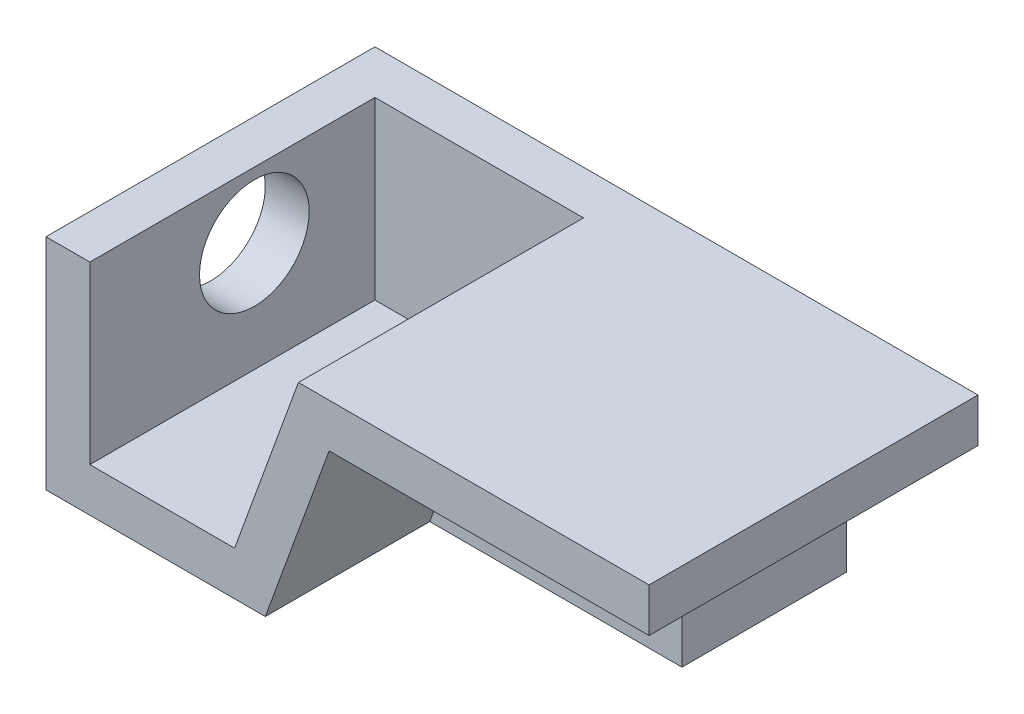
ISO-10303-21;
HEADER;
FILE_DESCRIPTION(('STEP AP214'),'2;1');
FILE_NAME('part.step','',(''),(''),'','','');
FILE_SCHEMA(('AUTOMOTIVE_DESIGN { 1 0 10303 214 1 1 1 1 }'));
ENDSEC;
DATA;
#1=APPLICATION_CONTEXT('core data for automotive mechanical design processes');
#2=APPLICATION_PROTOCOL_DEFINITION('international standard','automotive_design',2000,#1);
#3=PRODUCT_CONTEXT('',#1,'mechanical');
#4=PRODUCT('Part','Part','',(#3));
#5=PRODUCT_RELATED_PRODUCT_CATEGORY('part','',(#4));
#6=PRODUCT_DEFINITION_FORMATION('','',#4);
#7=PRODUCT_DEFINITION_CONTEXT('part definition',#1,'design');
#8=PRODUCT_DEFINITION('design','',#6,#7);
#9=PRODUCT_DEFINITION_SHAPE('','',#8);
#10=(LENGTH_UNIT() NAMED_UNIT(*) SI_UNIT(.MILLI.,.METRE.));
#11=(NAMED_UNIT(*) PLANE_ANGLE_UNIT() SI_UNIT($,.RADIAN.));
#12=(NAMED_UNIT(*) SI_UNIT($,.STERADIAN.) SOLID_ANGLE_UNIT());
#13=UNCERTAINTY_MEASURE_WITH_UNIT(LENGTH_MEASURE(1.E-05),#10,'distance_accuracy_value','');
#14=(GEOMETRIC_REPRESENTATION_CONTEXT(3) GLOBAL_UNCERTAINTY_ASSIGNED_CONTEXT((#13)) GLOBAL_UNIT_ASSIGNED_CONTEXT((#10,
#11,#12)) REPRESENTATION_CONTEXT('',''));
#15=CARTESIAN_POINT('',(0.,0.,0.));
#16=DIRECTION('',(0.,0.,1.));
#17=DIRECTION('',(1.,0.,0.));
#18=AXIS2_PLACEMENT_3D('',#15,#16,#17);
#19=CARTESIAN_POINT('',(0.,0.,-150.));
#20=DIRECTION('',(0.,0.,-1.));
#21=DIRECTION('',(-1.,0.,0.));
#22=AXIS2_PLACEMENT_3D('',#19,#20,#21);
#23=PLANE('',#22);
#24=DIRECTION('',(1.,0.,0.));
#25=VECTOR('',#24,1.);
#26=CARTESIAN_POINT('',(194.442858756466,116.939281767956,-150.));
#27=LINE('',#26,#25);
#28=CARTESIAN_POINT('',(366.207621273874,116.939281767956,-150.));
#29=VERTEX_POINT('',#28);
#30=CARTESIAN_POINT('',(486.207621273874,116.939281767956,-150.));
#31=VERTEX_POINT('',#30);
#32=EDGE_CURVE('E145',#29,#31,#27,.T.);
#33=ORIENTED_EDGE('',*,*,#32,.F.);
#34=DIRECTION('',(0.,-1.,0.));
#35=VECTOR('',#34,1.);
#36=CARTESIAN_POINT('',(366.207621273874,156.939281767956,-150.));
#37=LINE('',#36,#35);
#38=CARTESIAN_POINT('',(366.207621273874,-43.0607182320442,-150.));
#39=VERTEX_POINT('',#38);
#40=EDGE_CURVE('E78',#29,#39,#37,.T.);
#41=ORIENTED_EDGE('',*,*,#40,.T.);
#42=DIRECTION('',(1.,0.,0.));
#43=VECTOR('',#42,1.);
#44=CARTESIAN_POINT('',(-63.7923787261258,-43.0607182320442,-150.));
#45=LINE('',#44,#43);
#46=CARTESIAN_POINT('',(-63.7923787261258,-43.0607182320442,-150.));
#47=VERTEX_POINT('',#46);
#48=EDGE_CURVE('E191',#47,#39,#45,.T.);
#49=ORIENTED_EDGE('',*,*,#48,.F.);
#50=DIRECTION('',(0.,-1.,0.));
#51=VECTOR('',#50,1.);
#52=CARTESIAN_POINT('',(-63.7923787261258,156.939281767956,-150.));
#53=LINE('',#52,#51);
#54=CARTESIAN_POINT('',(-63.7923787261258,156.939281767956,-150.));
#55=VERTEX_POINT('',#54);
#56=EDGE_CURVE('E197',#55,#47,#53,.T.);
#57=ORIENTED_EDGE('',*,*,#56,.F.);
#58=DIRECTION('',(1.,0.,0.));
#59=VECTOR('',#58,1.);
#60=CARTESIAN_POINT('',(166.434557228078,156.939281767956,-150.));
#61=LINE('',#60,#59);
#62=CARTESIAN_POINT('',(486.207621273874,156.939281767956,-150.));
#63=VERTEX_POINT('',#62);
#64=EDGE_CURVE('E67',#55,#63,#61,.T.);
#65=ORIENTED_EDGE('',*,*,#64,.T.);
#66=DIRECTION('',(0.,-1.,0.));
#67=VECTOR('',#66,1.);
#68=CARTESIAN_POINT('',(486.207621273874,156.939281767956,-150.));
#69=LINE('',#68,#67);
#70=EDGE_CURVE('E142',#63,#31,#69,.T.);
#71=ORIENTED_EDGE('',*,*,#70,.T.);
#72=EDGE_LOOP('',(#33,#41,#49,#57,#65,#71));
#73=FACE_BOUND('',#72,.T.);
#74=CARTESIAN_POINT('',(273.853471050249,21.9392817679558,-150.));
#75=DIRECTION('',(0.,0.,1.));
#76=DIRECTION('',(1.,0.,0.));
#77=AXIS2_PLACEMENT_3D('',#74,#75,#76);
#78=CIRCLE('',#77,50.);
#79=CARTESIAN_POINT('',(323.853471050249,21.9392817679558,-150.));
#80=VERTEX_POINT('',#79);
#81=EDGE_CURVE('E187',#80,#80,#78,.T.);
#82=ORIENTED_EDGE('',*,*,#81,.T.);
#83=EDGE_LOOP('',(#82));
#84=FACE_BOUND('',#83,.T.);
#85=ADVANCED_FACE('F38',(#73,#84),#23,.T.);
#86=CARTESIAN_POINT('',(166.434557228078,156.939281767956,150.));
#87=DIRECTION('',(0.,1.,0.));
#88=DIRECTION('',(0.,0.,1.));
#89=AXIS2_PLACEMENT_3D('',#86,#87,#88);
#90=PLANE('',#89);
#91=DIRECTION('',(1.,0.,0.));
#92=VECTOR('',#91,1.);
#93=CARTESIAN_POINT('',(166.434557228078,156.939281767956,-110.));
#94=LINE('',#93,#92);
#95=CARTESIAN_POINT('',(-23.7923787261258,156.939281767956,-110.));
#96=VERTEX_POINT('',#95);
#97=CARTESIAN_POINT('',(166.434557228078,156.939281767956,-110.));
#98=VERTEX_POINT('',#97);
#99=EDGE_CURVE('E173',#96,#98,#94,.T.);
#100=ORIENTED_EDGE('',*,*,#99,.T.);
#101=DIRECTION('',(0.,0.,-1.));
#102=VECTOR('',#101,1.);
#103=CARTESIAN_POINT('',(166.434557228078,156.939281767956,150.));
#104=LINE('',#103,#102);
#105=CARTESIAN_POINT('',(166.434557228078,156.939281767956,150.));
#106=VERTEX_POINT('',#105);
#107=EDGE_CURVE('E155',#106,#98,#104,.T.);
#108=ORIENTED_EDGE('',*,*,#107,.F.);
#109=DIRECTION('',(1.,0.,0.));
#110=VECTOR('',#109,1.);
#111=CARTESIAN_POINT('',(166.434557228078,156.939281767956,150.));
#112=LINE('',#111,#110);
#113=CARTESIAN_POINT('',(486.207621273874,156.939281767956,150.));
#114=VERTEX_POINT('',#113);
#115=EDGE_CURVE('E219',#106,#114,#112,.T.);
#116=ORIENTED_EDGE('',*,*,#115,.T.);
#117=DIRECTION('',(0.,0.,-1.));
#118=VECTOR('',#117,1.);
#119=CARTESIAN_POINT('',(486.207621273874,156.939281767956,150.));
#120=LINE('',#119,#118);
#121=EDGE_CURVE('E153',#114,#63,#120,.T.);
#122=ORIENTED_EDGE('',*,*,#121,.T.);
#123=ORIENTED_EDGE('',*,*,#64,.F.);
#124=DIRECTION('',(0.,0.,-1.));
#125=VECTOR('',#124,1.);
#126=CARTESIAN_POINT('',(-63.7923787261259,156.939281767956,150.));
#127=LINE('',#126,#125);
#128=CARTESIAN_POINT('',(-63.7923787261259,156.939281767956,150.));
#129=VERTEX_POINT('',#128);
#130=EDGE_CURVE('E11',#129,#55,#127,.T.);
#131=ORIENTED_EDGE('',*,*,#130,.F.);
#132=DIRECTION('',(1.,0.,0.));
#133=VECTOR('',#132,1.);
#134=CARTESIAN_POINT('',(-63.7923787261259,156.939281767956,150.));
#135=LINE('',#134,#133);
#136=CARTESIAN_POINT('',(-23.7923787261259,156.939281767956,150.));
#137=VERTEX_POINT('',#136);
#138=EDGE_CURVE('E146',#129,#137,#135,.T.);
#139=ORIENTED_EDGE('',*,*,#138,.T.);
#140=DIRECTION('',(0.,0.,-1.));
#141=VECTOR('',#140,1.);
#142=CARTESIAN_POINT('',(-23.7923787261259,156.939281767956,150.));
#143=LINE('',#142,#141);
#144=EDGE_CURVE('E42',#137,#96,#143,.T.);
#145=ORIENTED_EDGE('',*,*,#144,.T.);
#146=EDGE_LOOP('',(#100,#108,#116,#122,#123,#131,#139,#145));
#147=FACE_BOUND('',#146,.T.);
#148=ADVANCED_FACE('F170',(#147),#90,.T.);
#149=CARTESIAN_POINT('',(-63.7923787261259,156.939281767956,150.));
#150=DIRECTION('',(1.,0.,0.));
#151=DIRECTION('',(0.,1.,0.));
#152=AXIS2_PLACEMENT_3D('',#149,#150,#151);
#153=PLANE('',#152);
#154=CARTESIAN_POINT('',(-63.7923787261258,96.9392817679558,0.));
#155=DIRECTION('',(-1.,0.,0.));
#156=DIRECTION('',(0.,0.,1.));
#157=AXIS2_PLACEMENT_3D('',#154,#155,#156);
#158=CIRCLE('',#157,50.);
#159=CARTESIAN_POINT('',(-63.7923787261258,96.9392817679558,50.));
#160=VERTEX_POINT('',#159);
#161=EDGE_CURVE('E458',#160,#160,#158,.T.);
#162=ORIENTED_EDGE('',*,*,#161,.F.);
#163=EDGE_LOOP('',(#162));
#164=FACE_BOUND('',#163,.T.);
#165=ORIENTED_EDGE('',*,*,#130,.T.);
#166=ORIENTED_EDGE('',*,*,#56,.T.);
#167=DIRECTION('',(0.,0.,-1.));
#168=VECTOR('',#167,1.);
#169=CARTESIAN_POINT('',(-63.7923787261258,-43.0607182320442,150.));
#170=LINE('',#169,#168);
#171=CARTESIAN_POINT('',(-63.7923787261258,-43.0607182320442,150.));
#172=VERTEX_POINT('',#171);
#173=EDGE_CURVE('E48',#172,#47,#170,.T.);
#174=ORIENTED_EDGE('',*,*,#173,.F.);
#175=DIRECTION('',(0.,-1.,0.));
#176=VECTOR('',#175,1.);
#177=CARTESIAN_POINT('',(-63.7923787261259,156.939281767956,150.));
#178=LINE('',#177,#176);
#179=EDGE_CURVE('E114',#129,#172,#178,.T.);
#180=ORIENTED_EDGE('',*,*,#179,.F.);
#181=EDGE_LOOP('',(#165,#166,#174,#180));
#182=FACE_BOUND('',#181,.T.);
#183=ADVANCED_FACE('F255',(#164,#182),#153,.F.);
#184=CARTESIAN_POINT('',(-63.7923787261258,-43.0607182320442,150.));
#185=DIRECTION('',(0.,1.,0.));
#186=DIRECTION('',(0.,0.,1.));
#187=AXIS2_PLACEMENT_3D('',#184,#185,#186);
#188=PLANE('',#187);
#189=ORIENTED_EDGE('',*,*,#173,.T.);
#190=ORIENTED_EDGE('',*,*,#48,.T.);
#191=DIRECTION('',(0.,0.,1.));
#192=VECTOR('',#191,1.);
#193=CARTESIAN_POINT('',(366.207621273874,-43.0607182320442,-150.));
#194=LINE('',#193,#192);
#195=CARTESIAN_POINT('',(366.207621273874,-43.0607182320442,0.));
#196=VERTEX_POINT('',#195);
#197=EDGE_CURVE('E194',#39,#196,#194,.T.);
#198=ORIENTED_EDGE('',*,*,#197,.T.);
#199=DIRECTION('',(-1.,0.,0.));
#200=VECTOR('',#199,1.);
#201=CARTESIAN_POINT('',(366.207621273874,-43.0607182320442,0.));
#202=LINE('',#201,#200);
#203=CARTESIAN_POINT('',(136.207621273874,-43.0607182320442,0.));
#204=VERTEX_POINT('',#203);
#205=EDGE_CURVE('E126',#196,#204,#202,.T.);
#206=ORIENTED_EDGE('',*,*,#205,.T.);
#207=DIRECTION('',(0.,0.,-1.));
#208=VECTOR('',#207,1.);
#209=CARTESIAN_POINT('',(136.207621273874,-43.0607182320442,150.));
#210=LINE('',#209,#208);
#211=CARTESIAN_POINT('',(136.207621273874,-43.0607182320442,150.));
#212=VERTEX_POINT('',#211);
#213=EDGE_CURVE('E121',#212,#204,#210,.T.);
#214=ORIENTED_EDGE('',*,*,#213,.F.);
#215=DIRECTION('',(1.,0.,0.));
#216=VECTOR('',#215,1.);
#217=CARTESIAN_POINT('',(-63.7923787261258,-43.0607182320442,150.));
#218=LINE('',#217,#216);
#219=EDGE_CURVE('E107',#172,#212,#218,.T.);
#220=ORIENTED_EDGE('',*,*,#219,.F.);
#221=EDGE_LOOP('',(#189,#190,#198,#206,#214,#220));
#222=FACE_BOUND('',#221,.T.);
#223=ADVANCED_FACE('F122',(#222),#188,.F.);
#224=CARTESIAN_POINT('',(136.207621273874,-43.0607182320442,150.));
#225=DIRECTION('',(-0.93969262078591,0.342020143325666,0.));
#226=DIRECTION('',(-0.342020143325666,-0.93969262078591,0.));
#227=AXIS2_PLACEMENT_3D('',#224,#225,#226);
#228=PLANE('',#227);
#229=ORIENTED_EDGE('',*,*,#213,.T.);
#230=DIRECTION('',(0.342020143325666,0.93969262078591,0.));
#231=VECTOR('',#230,1.);
#232=CARTESIAN_POINT('',(136.207621273874,-43.0607182320442,0.));
#233=LINE('',#232,#231);
#234=CARTESIAN_POINT('',(194.442858756466,116.939281767956,0.));
#235=VERTEX_POINT('',#234);
#236=EDGE_CURVE('E143',#204,#235,#233,.T.);
#237=ORIENTED_EDGE('',*,*,#236,.T.);
#238=DIRECTION('',(0.,0.,-1.));
#239=VECTOR('',#238,1.);
#240=CARTESIAN_POINT('',(194.442858756466,116.939281767956,150.));
#241=LINE('',#240,#239);
#242=CARTESIAN_POINT('',(194.442858756466,116.939281767956,150.));
#243=VERTEX_POINT('',#242);
#244=EDGE_CURVE('E129',#243,#235,#241,.T.);
#245=ORIENTED_EDGE('',*,*,#244,.F.);
#246=DIRECTION('',(0.342020143325666,0.939692620785909,0.));
#247=VECTOR('',#246,1.);
#248=CARTESIAN_POINT('',(136.207621273874,-43.0607182320442,150.));
#249=LINE('',#248,#247);
#250=EDGE_CURVE('E112',#212,#243,#249,.T.);
#251=ORIENTED_EDGE('',*,*,#250,.F.);
#252=EDGE_LOOP('',(#229,#237,#245,#251));
#253=FACE_BOUND('',#252,.T.);
#254=ADVANCED_FACE('F131',(#253),#228,.F.);
#255=CARTESIAN_POINT('',(194.442858756466,116.939281767956,150.));
#256=DIRECTION('',(0.,1.,0.));
#257=DIRECTION('',(0.,0.,1.));
#258=AXIS2_PLACEMENT_3D('',#255,#256,#257);
#259=PLANE('',#258);
#260=ORIENTED_EDGE('',*,*,#244,.T.);
#261=DIRECTION('',(1.,0.,0.));
#262=VECTOR('',#261,1.);
#263=CARTESIAN_POINT('',(194.442858756466,116.939281767956,0.));
#264=LINE('',#263,#262);
#265=CARTESIAN_POINT('',(366.207621273874,116.939281767956,0.));
#266=VERTEX_POINT('',#265);
#267=EDGE_CURVE('E206',#235,#266,#264,.T.);
#268=ORIENTED_EDGE('',*,*,#267,.T.);
#269=DIRECTION('',(0.,0.,-1.));
#270=VECTOR('',#269,1.);
#271=CARTESIAN_POINT('',(366.207621273874,116.939281767956,150.));
#272=LINE('',#271,#270);
#273=EDGE_CURVE('E200',#266,#29,#272,.T.);
#274=ORIENTED_EDGE('',*,*,#273,.T.);
#275=ORIENTED_EDGE('',*,*,#32,.T.);
#276=DIRECTION('',(0.,0.,-1.));
#277=VECTOR('',#276,1.);
#278=CARTESIAN_POINT('',(486.207621273874,116.939281767956,150.));
#279=LINE('',#278,#277);
#280=CARTESIAN_POINT('',(486.207621273874,116.939281767956,150.));
#281=VERTEX_POINT('',#280);
#282=EDGE_CURVE('E150',#281,#31,#279,.T.);
#283=ORIENTED_EDGE('',*,*,#282,.F.);
#284=DIRECTION('',(1.,0.,0.));
#285=VECTOR('',#284,1.);
#286=CARTESIAN_POINT('',(194.442858756466,116.939281767956,150.));
#287=LINE('',#286,#285);
#288=EDGE_CURVE('E134',#243,#281,#287,.T.);
#289=ORIENTED_EDGE('',*,*,#288,.F.);
#290=EDGE_LOOP('',(#260,#268,#274,#275,#283,#289));
#291=FACE_BOUND('',#290,.T.);
#292=ADVANCED_FACE('F251',(#291),#259,.F.);
#293=CARTESIAN_POINT('',(486.207621273874,156.939281767956,150.));
#294=DIRECTION('',(1.,0.,0.));
#295=DIRECTION('',(0.,0.,-1.));
#296=AXIS2_PLACEMENT_3D('',#293,#294,#295);
#297=PLANE('',#296);
#298=ORIENTED_EDGE('',*,*,#70,.F.);
#299=ORIENTED_EDGE('',*,*,#121,.F.);
#300=DIRECTION('',(0.,-1.,0.));
#301=VECTOR('',#300,1.);
#302=CARTESIAN_POINT('',(486.207621273874,156.939281767956,150.));
#303=LINE('',#302,#301);
#304=EDGE_CURVE('E136',#114,#281,#303,.T.);
#305=ORIENTED_EDGE('',*,*,#304,.T.);
#306=ORIENTED_EDGE('',*,*,#282,.T.);
#307=EDGE_LOOP('',(#298,#299,#305,#306));
#308=FACE_BOUND('',#307,.T.);
#309=ADVANCED_FACE('F225',(#308),#297,.T.);
#310=CARTESIAN_POINT('',(108.199319745486,-3.06071823204421,150.));
#311=DIRECTION('',(-0.93969262078591,0.342020143325666,0.));
#312=DIRECTION('',(-0.342020143325666,-0.93969262078591,0.));
#313=AXIS2_PLACEMENT_3D('',#310,#311,#312);
#314=PLANE('',#313);
#315=ORIENTED_EDGE('',*,*,#107,.T.);
#316=DIRECTION('',(-0.342020143325666,-0.93969262078591,0.));
#317=VECTOR('',#316,1.);
#318=CARTESIAN_POINT('',(108.199319745486,-3.06071823204421,-110.));
#319=LINE('',#318,#317);
#320=CARTESIAN_POINT('',(108.199319745486,-3.06071823204421,-110.));
#321=VERTEX_POINT('',#320);
#322=EDGE_CURVE('E185',#98,#321,#319,.T.);
#323=ORIENTED_EDGE('',*,*,#322,.T.);
#324=DIRECTION('',(0.,0.,-1.));
#325=VECTOR('',#324,1.);
#326=CARTESIAN_POINT('',(108.199319745486,-3.06071823204421,150.));
#327=LINE('',#326,#325);
#328=CARTESIAN_POINT('',(108.199319745486,-3.06071823204421,150.));
#329=VERTEX_POINT('',#328);
#330=EDGE_CURVE('E158',#329,#321,#327,.T.);
#331=ORIENTED_EDGE('',*,*,#330,.F.);
#332=DIRECTION('',(0.342020143325666,0.939692620785909,0.));
#333=VECTOR('',#332,1.);
#334=CARTESIAN_POINT('',(108.199319745486,-3.06071823204421,150.));
#335=LINE('',#334,#333);
#336=EDGE_CURVE('E216',#329,#106,#335,.T.);
#337=ORIENTED_EDGE('',*,*,#336,.T.);
#338=EDGE_LOOP('',(#315,#323,#331,#337));
#339=FACE_BOUND('',#338,.T.);
#340=ADVANCED_FACE('F230',(#339),#314,.T.);
#341=CARTESIAN_POINT('',(-23.7923787261259,-3.06071823204421,150.));
#342=DIRECTION('',(0.,1.,0.));
#343=DIRECTION('',(0.,0.,1.));
#344=AXIS2_PLACEMENT_3D('',#341,#342,#343);
#345=PLANE('',#344);
#346=ORIENTED_EDGE('',*,*,#330,.T.);
#347=DIRECTION('',(-1.,0.,0.));
#348=VECTOR('',#347,1.);
#349=CARTESIAN_POINT('',(166.434557228078,-3.06071823204421,-110.));
#350=LINE('',#349,#348);
#351=CARTESIAN_POINT('',(-23.7923787261258,-3.06071823204421,-110.));
#352=VERTEX_POINT('',#351);
#353=EDGE_CURVE('E181',#321,#352,#350,.T.);
#354=ORIENTED_EDGE('',*,*,#353,.T.);
#355=DIRECTION('',(0.,0.,-1.));
#356=VECTOR('',#355,1.);
#357=CARTESIAN_POINT('',(-23.7923787261259,-3.06071823204421,150.));
#358=LINE('',#357,#356);
#359=CARTESIAN_POINT('',(-23.7923787261259,-3.06071823204421,150.));
#360=VERTEX_POINT('',#359);
#361=EDGE_CURVE('E160',#360,#352,#358,.T.);
#362=ORIENTED_EDGE('',*,*,#361,.F.);
#363=DIRECTION('',(1.,0.,0.));
#364=VECTOR('',#363,1.);
#365=CARTESIAN_POINT('',(-23.7923787261259,-3.06071823204421,150.));
#366=LINE('',#365,#364);
#367=EDGE_CURVE('E213',#360,#329,#366,.T.);
#368=ORIENTED_EDGE('',*,*,#367,.T.);
#369=EDGE_LOOP('',(#346,#354,#362,#368));
#370=FACE_BOUND('',#369,.T.);
#371=ADVANCED_FACE('F258',(#370),#345,.T.);
#372=CARTESIAN_POINT('',(-23.7923787261259,156.939281767956,150.));
#373=DIRECTION('',(1.,0.,0.));
#374=DIRECTION('',(0.,0.,-1.));
#375=AXIS2_PLACEMENT_3D('',#372,#373,#374);
#376=PLANE('',#375);
#377=CARTESIAN_POINT('',(-23.7923787261259,96.9392817679558,0.));
#378=DIRECTION('',(1.,0.,0.));
#379=DIRECTION('',(0.,0.,-1.));
#380=AXIS2_PLACEMENT_3D('',#377,#378,#379);
#381=CIRCLE('',#380,50.);
#382=CARTESIAN_POINT('',(-23.7923787261259,96.9392817679558,-50.));
#383=VERTEX_POINT('',#382);
#384=EDGE_CURVE('E461',#383,#383,#381,.T.);
#385=ORIENTED_EDGE('',*,*,#384,.F.);
#386=EDGE_LOOP('',(#385));
#387=FACE_BOUND('',#386,.T.);
#388=ORIENTED_EDGE('',*,*,#361,.T.);
#389=DIRECTION('',(0.,1.,0.));
#390=VECTOR('',#389,1.);
#391=CARTESIAN_POINT('',(-23.7923787261258,-174.879833773421,-110.));
#392=LINE('',#391,#390);
#393=EDGE_CURVE('E177',#352,#96,#392,.T.);
#394=ORIENTED_EDGE('',*,*,#393,.T.);
#395=ORIENTED_EDGE('',*,*,#144,.F.);
#396=DIRECTION('',(0.,-1.,0.));
#397=VECTOR('',#396,1.);
#398=CARTESIAN_POINT('',(-23.7923787261259,156.939281767956,150.));
#399=LINE('',#398,#397);
#400=EDGE_CURVE('E211',#137,#360,#399,.T.);
#401=ORIENTED_EDGE('',*,*,#400,.T.);
#402=EDGE_LOOP('',(#388,#394,#395,#401));
#403=FACE_BOUND('',#402,.T.);
#404=ADVANCED_FACE('F40',(#387,#403),#376,.T.);
#405=CARTESIAN_POINT('',(0.,0.,150.));
#406=DIRECTION('',(0.,0.,-1.));
#407=DIRECTION('',(-1.,0.,0.));
#408=AXIS2_PLACEMENT_3D('',#405,#406,#407);
#409=PLANE('',#408);
#410=ORIENTED_EDGE('',*,*,#138,.F.);
#411=ORIENTED_EDGE('',*,*,#179,.T.);
#412=ORIENTED_EDGE('',*,*,#219,.T.);
#413=ORIENTED_EDGE('',*,*,#250,.T.);
#414=ORIENTED_EDGE('',*,*,#288,.T.);
#415=ORIENTED_EDGE('',*,*,#304,.F.);
#416=ORIENTED_EDGE('',*,*,#115,.F.);
#417=ORIENTED_EDGE('',*,*,#336,.F.);
#418=ORIENTED_EDGE('',*,*,#367,.F.);
#419=ORIENTED_EDGE('',*,*,#400,.F.);
#420=EDGE_LOOP('',(#410,#411,#412,#413,#414,#415,#416,#417,#418,#419));
#421=FACE_BOUND('',#420,.T.);
#422=ADVANCED_FACE('F110',(#421),#409,.F.);
#423=CARTESIAN_POINT('',(366.207621273874,156.939281767956,-150.));
#424=DIRECTION('',(1.,0.,0.));
#425=DIRECTION('',(0.,0.,-1.));
#426=AXIS2_PLACEMENT_3D('',#423,#424,#425);
#427=PLANE('',#426);
#428=ORIENTED_EDGE('',*,*,#273,.F.);
#429=DIRECTION('',(0.,-1.,0.));
#430=VECTOR('',#429,1.);
#431=CARTESIAN_POINT('',(366.207621273874,156.939281767956,0.));
#432=LINE('',#431,#430);
#433=EDGE_CURVE('E201',#266,#196,#432,.T.);
#434=ORIENTED_EDGE('',*,*,#433,.T.);
#435=ORIENTED_EDGE('',*,*,#197,.F.);
#436=ORIENTED_EDGE('',*,*,#40,.F.);
#437=EDGE_LOOP('',(#428,#434,#435,#436));
#438=FACE_BOUND('',#437,.T.);
#439=ADVANCED_FACE('F246',(#438),#427,.T.);
#440=CARTESIAN_POINT('',(366.207621273874,156.939281767956,0.));
#441=DIRECTION('',(0.,0.,1.));
#442=DIRECTION('',(1.,0.,0.));
#443=AXIS2_PLACEMENT_3D('',#440,#441,#442);
#444=PLANE('',#443);
#445=CARTESIAN_POINT('',(273.853471050249,21.9392817679558,0.));
#446=DIRECTION('',(0.,0.,1.));
#447=DIRECTION('',(1.,0.,0.));
#448=AXIS2_PLACEMENT_3D('',#445,#446,#447);
#449=CIRCLE('',#448,50.);
#450=CARTESIAN_POINT('',(323.853471050249,21.9392817679558,0.));
#451=VERTEX_POINT('',#450);
#452=EDGE_CURVE('E462',#451,#451,#449,.T.);
#453=ORIENTED_EDGE('',*,*,#452,.F.);
#454=EDGE_LOOP('',(#453));
#455=FACE_BOUND('',#454,.T.);
#456=ORIENTED_EDGE('',*,*,#236,.F.);
#457=ORIENTED_EDGE('',*,*,#205,.F.);
#458=ORIENTED_EDGE('',*,*,#433,.F.);
#459=ORIENTED_EDGE('',*,*,#267,.F.);
#460=EDGE_LOOP('',(#456,#457,#458,#459));
#461=FACE_BOUND('',#460,.T.);
#462=ADVANCED_FACE('F250',(#455,#461),#444,.T.);
#463=CARTESIAN_POINT('',(166.434557228078,-174.879833773421,-110.));
#464=DIRECTION('',(0.,0.,1.));
#465=DIRECTION('',(1.,0.,0.));
#466=AXIS2_PLACEMENT_3D('',#463,#464,#465);
#467=PLANE('',#466);
#468=ORIENTED_EDGE('',*,*,#353,.F.);
#469=ORIENTED_EDGE('',*,*,#322,.F.);
#470=ORIENTED_EDGE('',*,*,#99,.F.);
#471=ORIENTED_EDGE('',*,*,#393,.F.);
#472=EDGE_LOOP('',(#468,#469,#470,#471));
#473=FACE_BOUND('',#472,.T.);
#474=ADVANCED_FACE('F183',(#473),#467,.T.);
#475=CARTESIAN_POINT('',(273.853471050249,21.9392817679558,0.));
#476=DIRECTION('',(0.,0.,1.));
#477=DIRECTION('',(1.,0.,0.));
#478=AXIS2_PLACEMENT_3D('',#475,#476,#477);
#479=CYLINDRICAL_SURFACE('',#478,50.);
#480=ORIENTED_EDGE('',*,*,#81,.F.);
#481=EDGE_LOOP('',(#480));
#482=FACE_BOUND('',#481,.T.);
#483=ORIENTED_EDGE('',*,*,#452,.T.);
#484=EDGE_LOOP('',(#483));
#485=FACE_BOUND('',#484,.T.);
#486=ADVANCED_FACE('F347',(#482,#485),#479,.F.);
#487=CARTESIAN_POINT('',(-63.7923787261258,96.9392817679558,0.));
#488=DIRECTION('',(-1.,0.,0.));
#489=DIRECTION('',(0.,0.,1.));
#490=AXIS2_PLACEMENT_3D('',#487,#488,#489);
#491=CYLINDRICAL_SURFACE('',#490,50.);
#492=ORIENTED_EDGE('',*,*,#161,.T.);
#493=EDGE_LOOP('',(#492));
#494=FACE_BOUND('',#493,.T.);
#495=ORIENTED_EDGE('',*,*,#384,.T.);
#496=EDGE_LOOP('',(#495));
#497=FACE_BOUND('',#496,.T.);
#498=ADVANCED_FACE('F359',(#494,#497),#491,.F.);
#499=CLOSED_SHELL('',(#85,#148,#183,#223,#254,#292,#309,#340,#371,#404,#422,#439,#462,#474,#486,#498));
#500=MANIFOLD_SOLID_BREP('B2',#499);
#501=ADVANCED_BREP_SHAPE_REPRESENTATION('',(#18,#500),#14);
#502=SHAPE_DEFINITION_REPRESENTATION(#9,#501);
ENDSEC;
END-ISO-10303-21;
